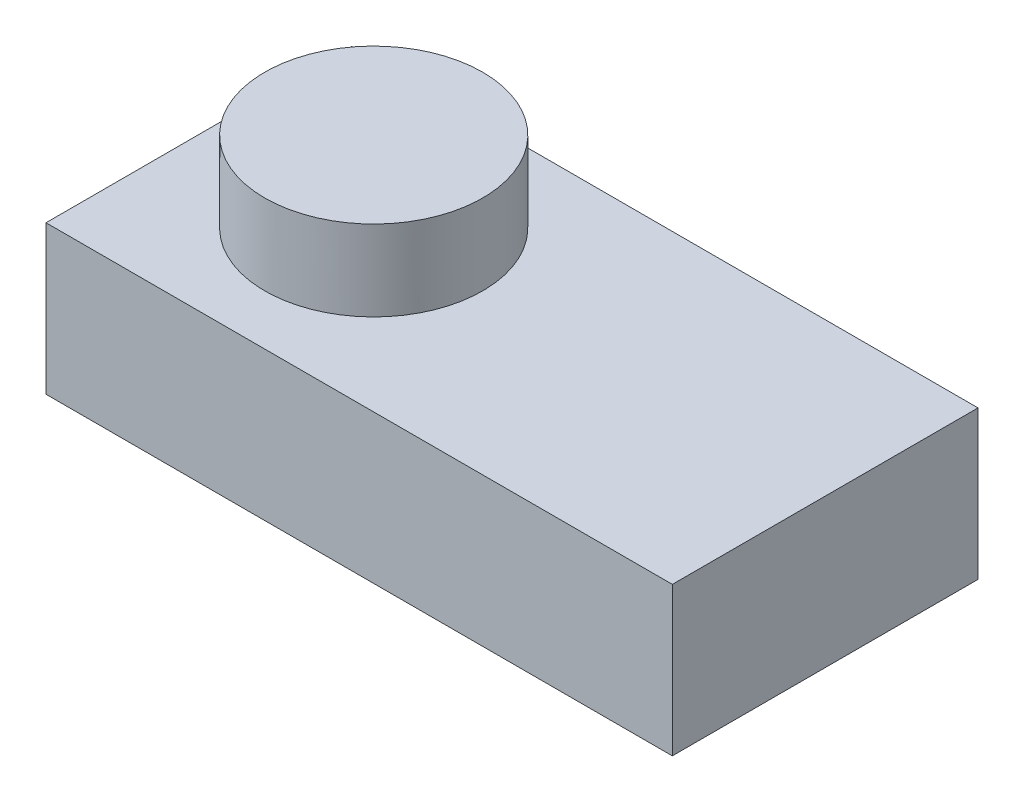
ISO-10303-21;
HEADER;
FILE_DESCRIPTION(('STEP AP214'),'2;1');
FILE_NAME('part.step','',(''),(''),'','','');
FILE_SCHEMA(('AUTOMOTIVE_DESIGN { 1 0 10303 214 1 1 1 1 }'));
ENDSEC;
DATA;
#1=APPLICATION_CONTEXT('core data for automotive mechanical design processes');
#2=APPLICATION_PROTOCOL_DEFINITION('international standard','automotive_design',2000,#1);
#3=PRODUCT_CONTEXT('',#1,'mechanical');
#4=PRODUCT('Part','Part','',(#3));
#5=PRODUCT_RELATED_PRODUCT_CATEGORY('part','',(#4));
#6=PRODUCT_DEFINITION_FORMATION('','',#4);
#7=PRODUCT_DEFINITION_CONTEXT('part definition',#1,'design');
#8=PRODUCT_DEFINITION('design','',#6,#7);
#9=PRODUCT_DEFINITION_SHAPE('','',#8);
#10=(LENGTH_UNIT() NAMED_UNIT(*) SI_UNIT(.MILLI.,.METRE.));
#11=(NAMED_UNIT(*) PLANE_ANGLE_UNIT() SI_UNIT($,.RADIAN.));
#12=(NAMED_UNIT(*) SI_UNIT($,.STERADIAN.) SOLID_ANGLE_UNIT());
#13=UNCERTAINTY_MEASURE_WITH_UNIT(LENGTH_MEASURE(1.E-05),#10,'distance_accuracy_value','');
#14=(GEOMETRIC_REPRESENTATION_CONTEXT(3) GLOBAL_UNCERTAINTY_ASSIGNED_CONTEXT((#13)) GLOBAL_UNIT_ASSIGNED_CONTEXT((#10,
#11,#12)) REPRESENTATION_CONTEXT('',''));
#15=CARTESIAN_POINT('',(0.,0.,0.));
#16=DIRECTION('',(0.,0.,1.));
#17=DIRECTION('',(1.,0.,0.));
#18=AXIS2_PLACEMENT_3D('',#15,#16,#17);
#19=CARTESIAN_POINT('',(-12.5481780078409,-22.524278329157,36.691576079945));
#20=DIRECTION('',(1.,0.,0.));
#21=DIRECTION('',(0.,1.,0.));
#22=AXIS2_PLACEMENT_3D('',#19,#20,#21);
#23=PLANE('',#22);
#24=DIRECTION('',(0.,0.,-1.));
#25=VECTOR('',#24,1.);
#26=CARTESIAN_POINT('',(-12.5481780078409,1.47572167084304,36.691576079945));
#27=LINE('',#26,#25);
#28=CARTESIAN_POINT('',(-12.5481780078409,1.47572167084304,36.691576079945));
#29=VERTEX_POINT('',#28);
#30=CARTESIAN_POINT('',(-12.5481780078409,1.47572167084321,-12.691576079945));
#31=VERTEX_POINT('',#30);
#32=EDGE_CURVE('E110',#29,#31,#27,.T.);
#33=ORIENTED_EDGE('',*,*,#32,.T.);
#34=DIRECTION('',(0.,1.,0.));
#35=VECTOR('',#34,1.);
#36=CARTESIAN_POINT('',(-12.5481780078409,-22.5242783291568,-12.691576079945));
#37=LINE('',#36,#35);
#38=CARTESIAN_POINT('',(-12.5481780078409,-22.5242783291568,-12.691576079945));
#39=VERTEX_POINT('',#38);
#40=EDGE_CURVE('E48',#39,#31,#37,.T.);
#41=ORIENTED_EDGE('',*,*,#40,.F.);
#42=DIRECTION('',(0.,0.,-1.));
#43=VECTOR('',#42,1.);
#44=CARTESIAN_POINT('',(-12.5481780078409,-22.524278329157,36.691576079945));
#45=LINE('',#44,#43);
#46=CARTESIAN_POINT('',(-12.5481780078409,-22.524278329157,36.691576079945));
#47=VERTEX_POINT('',#46);
#48=EDGE_CURVE('E92',#47,#39,#45,.T.);
#49=ORIENTED_EDGE('',*,*,#48,.F.);
#50=DIRECTION('',(0.,1.,0.));
#51=VECTOR('',#50,1.);
#52=CARTESIAN_POINT('',(-12.5481780078409,-22.524278329157,36.691576079945));
#53=LINE('',#52,#51);
#54=EDGE_CURVE('E106',#47,#29,#53,.T.);
#55=ORIENTED_EDGE('',*,*,#54,.T.);
#56=EDGE_LOOP('',(#33,#41,#49,#55));
#57=FACE_BOUND('',#56,.T.);
#58=ADVANCED_FACE('F39',(#57),#23,.F.);
#59=CARTESIAN_POINT('',(-12.5481780078409,-22.5242783291568,-12.691576079945));
#60=DIRECTION('',(0.,0.,1.));
#61=DIRECTION('',(0.,-1.,0.));
#62=AXIS2_PLACEMENT_3D('',#59,#60,#61);
#63=PLANE('',#62);
#64=DIRECTION('',(1.,0.,0.));
#65=VECTOR('',#64,1.);
#66=CARTESIAN_POINT('',(-12.5481780078409,1.47572167084321,-12.691576079945));
#67=LINE('',#66,#65);
#68=CARTESIAN_POINT('',(88.6468059263599,1.47572167084321,-12.691576079945));
#69=VERTEX_POINT('',#68);
#70=EDGE_CURVE('E98',#31,#69,#67,.T.);
#71=ORIENTED_EDGE('',*,*,#70,.T.);
#72=DIRECTION('',(0.,1.,0.));
#73=VECTOR('',#72,1.);
#74=CARTESIAN_POINT('',(88.6468059263599,-22.5242783291568,-12.691576079945));
#75=LINE('',#74,#73);
#76=CARTESIAN_POINT('',(88.6468059263599,-22.5242783291568,-12.691576079945));
#77=VERTEX_POINT('',#76);
#78=EDGE_CURVE('E96',#77,#69,#75,.T.);
#79=ORIENTED_EDGE('',*,*,#78,.F.);
#80=DIRECTION('',(1.,0.,0.));
#81=VECTOR('',#80,1.);
#82=CARTESIAN_POINT('',(-12.5481780078409,-22.5242783291568,-12.691576079945));
#83=LINE('',#82,#81);
#84=EDGE_CURVE('E87',#39,#77,#83,.T.);
#85=ORIENTED_EDGE('',*,*,#84,.F.);
#86=ORIENTED_EDGE('',*,*,#40,.T.);
#87=EDGE_LOOP('',(#71,#79,#85,#86));
#88=FACE_BOUND('',#87,.T.);
#89=ADVANCED_FACE('F97',(#88),#63,.F.);
#90=CARTESIAN_POINT('',(88.6468059263599,-22.524278329157,36.691576079945));
#91=DIRECTION('',(-1.,0.,0.));
#92=DIRECTION('',(0.,-1.,0.));
#93=AXIS2_PLACEMENT_3D('',#90,#91,#92);
#94=PLANE('',#93);
#95=DIRECTION('',(0.,0.,1.));
#96=VECTOR('',#95,1.);
#97=CARTESIAN_POINT('',(88.6468059263599,1.47572167084304,36.691576079945));
#98=LINE('',#97,#96);
#99=CARTESIAN_POINT('',(88.6468059263599,1.47572167084304,36.691576079945));
#100=VERTEX_POINT('',#99);
#101=EDGE_CURVE('E73',#69,#100,#98,.T.);
#102=ORIENTED_EDGE('',*,*,#101,.T.);
#103=DIRECTION('',(0.,1.,0.));
#104=VECTOR('',#103,1.);
#105=CARTESIAN_POINT('',(88.6468059263599,-22.524278329157,36.691576079945));
#106=LINE('',#105,#104);
#107=CARTESIAN_POINT('',(88.6468059263599,-22.524278329157,36.691576079945));
#108=VERTEX_POINT('',#107);
#109=EDGE_CURVE('E100',#108,#100,#106,.T.);
#110=ORIENTED_EDGE('',*,*,#109,.F.);
#111=DIRECTION('',(0.,0.,1.));
#112=VECTOR('',#111,1.);
#113=CARTESIAN_POINT('',(88.6468059263599,-22.524278329157,36.691576079945));
#114=LINE('',#113,#112);
#115=EDGE_CURVE('E90',#77,#108,#114,.T.);
#116=ORIENTED_EDGE('',*,*,#115,.F.);
#117=ORIENTED_EDGE('',*,*,#78,.T.);
#118=EDGE_LOOP('',(#102,#110,#116,#117));
#119=FACE_BOUND('',#118,.T.);
#120=ADVANCED_FACE('F102',(#119),#94,.F.);
#121=CARTESIAN_POINT('',(-12.5481780078409,-22.524278329157,36.691576079945));
#122=DIRECTION('',(0.,0.,-1.));
#123=DIRECTION('',(0.,1.,0.));
#124=AXIS2_PLACEMENT_3D('',#121,#122,#123);
#125=PLANE('',#124);
#126=DIRECTION('',(-1.,0.,0.));
#127=VECTOR('',#126,1.);
#128=CARTESIAN_POINT('',(-12.5481780078409,1.47572167084304,36.691576079945));
#129=LINE('',#128,#127);
#130=EDGE_CURVE('E79',#100,#29,#129,.T.);
#131=ORIENTED_EDGE('',*,*,#130,.T.);
#132=ORIENTED_EDGE('',*,*,#54,.F.);
#133=DIRECTION('',(-1.,0.,0.));
#134=VECTOR('',#133,1.);
#135=CARTESIAN_POINT('',(-12.5481780078409,-22.524278329157,36.691576079945));
#136=LINE('',#135,#134);
#137=EDGE_CURVE('E56',#108,#47,#136,.T.);
#138=ORIENTED_EDGE('',*,*,#137,.F.);
#139=ORIENTED_EDGE('',*,*,#109,.T.);
#140=EDGE_LOOP('',(#131,#132,#138,#139));
#141=FACE_BOUND('',#140,.T.);
#142=ADVANCED_FACE('F140',(#141),#125,.F.);
#143=CARTESIAN_POINT('',(0.,-22.5242783291569,22.5242783291568));
#144=DIRECTION('',(0.,-1.,0.));
#145=DIRECTION('',(1.,0.,0.));
#146=AXIS2_PLACEMENT_3D('',#143,#144,#145);
#147=PLANE('',#146);
#148=ORIENTED_EDGE('',*,*,#48,.T.);
#149=ORIENTED_EDGE('',*,*,#84,.T.);
#150=ORIENTED_EDGE('',*,*,#115,.T.);
#151=ORIENTED_EDGE('',*,*,#137,.T.);
#152=EDGE_LOOP('',(#148,#149,#150,#151));
#153=FACE_BOUND('',#152,.T.);
#154=ADVANCED_FACE('F88',(#153),#147,.T.);
#155=CARTESIAN_POINT('',(0.,1.47572167084309,22.5242783291569));
#156=DIRECTION('',(0.,-1.,0.));
#157=DIRECTION('',(1.,0.,0.));
#158=AXIS2_PLACEMENT_3D('',#155,#156,#157);
#159=PLANE('',#158);
#160=CARTESIAN_POINT('',(14.6591622110464,1.47572167084313,10.95067627));
#161=DIRECTION('',(0.,-1.,0.));
#162=DIRECTION('',(0.,0.,-1.));
#163=AXIS2_PLACEMENT_3D('',#160,#161,#162);
#164=CIRCLE('',#163,17.6094789897099);
#165=CARTESIAN_POINT('',(14.6591622110464,1.47572167084319,-6.65880271970994));
#166=VERTEX_POINT('',#165);
#167=EDGE_CURVE('E11',#166,#166,#164,.F.);
#168=ORIENTED_EDGE('',*,*,#167,.F.);
#169=EDGE_LOOP('',(#168));
#170=FACE_BOUND('',#169,.T.);
#171=ORIENTED_EDGE('',*,*,#32,.F.);
#172=ORIENTED_EDGE('',*,*,#130,.F.);
#173=ORIENTED_EDGE('',*,*,#101,.F.);
#174=ORIENTED_EDGE('',*,*,#70,.F.);
#175=EDGE_LOOP('',(#171,#172,#173,#174));
#176=FACE_BOUND('',#175,.T.);
#177=ADVANCED_FACE('F128',(#170,#176),#159,.F.);
#178=CARTESIAN_POINT('',(14.6591622110464,14.4757216708431,10.9506762700001));
#179=DIRECTION('',(0.,-1.,0.));
#180=DIRECTION('',(0.,0.,-1.));
#181=AXIS2_PLACEMENT_3D('',#178,#179,#180);
#182=CYLINDRICAL_SURFACE('',#181,17.6094789897099);
#183=CARTESIAN_POINT('',(14.6591622110464,14.4757216708431,10.9506762700001));
#184=DIRECTION('',(0.,1.,0.));
#185=DIRECTION('',(0.,0.,1.));
#186=AXIS2_PLACEMENT_3D('',#183,#184,#185);
#187=CIRCLE('',#186,17.6094789897099);
#188=CARTESIAN_POINT('',(14.6591622110464,14.475721670843,28.56015525971));
#189=VERTEX_POINT('',#188);
#190=EDGE_CURVE('E114',#189,#189,#187,.T.);
#191=ORIENTED_EDGE('',*,*,#190,.F.);
#192=EDGE_LOOP('',(#191));
#193=FACE_BOUND('',#192,.T.);
#194=ORIENTED_EDGE('',*,*,#167,.T.);
#195=EDGE_LOOP('',(#194));
#196=FACE_BOUND('',#195,.T.);
#197=ADVANCED_FACE('F130',(#193,#196),#182,.T.);
#198=CARTESIAN_POINT('',(14.6591622110464,14.4757216708431,10.9506762700001));
#199=DIRECTION('',(0.,1.,0.));
#200=DIRECTION('',(0.,0.,1.));
#201=AXIS2_PLACEMENT_3D('',#198,#199,#200);
#202=PLANE('',#201);
#203=ORIENTED_EDGE('',*,*,#190,.T.);
#204=EDGE_LOOP('',(#203));
#205=FACE_BOUND('',#204,.T.);
#206=ADVANCED_FACE('F137',(#205),#202,.T.);
#207=CLOSED_SHELL('',(#58,#89,#120,#142,#154,#177,#197,#206));
#208=MANIFOLD_SOLID_BREP('B2',#207);
#209=ADVANCED_BREP_SHAPE_REPRESENTATION('',(#18,#208),#14);
#210=SHAPE_DEFINITION_REPRESENTATION(#9,#209);
ENDSEC;
END-ISO-10303-21;
